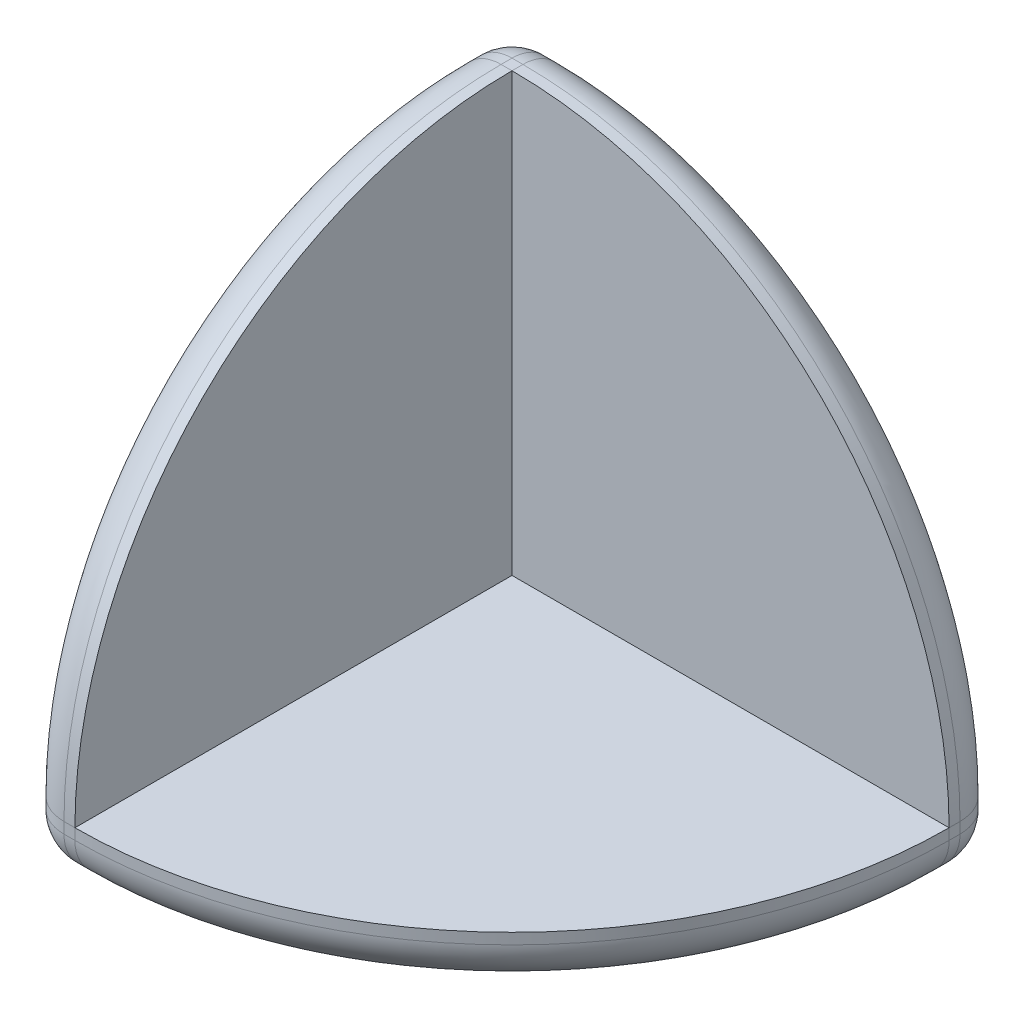
ISO-10303-21;
HEADER;
FILE_DESCRIPTION(('STEP AP214'),'2;1');
FILE_NAME('part.step','',(''),(''),'','','');
FILE_SCHEMA(('AUTOMOTIVE_DESIGN { 1 0 10303 214 1 1 1 1 }'));
ENDSEC;
DATA;
#1=APPLICATION_CONTEXT('core data for automotive mechanical design processes');
#2=APPLICATION_PROTOCOL_DEFINITION('international standard','automotive_design',2000,#1);
#3=PRODUCT_CONTEXT('',#1,'mechanical');
#4=PRODUCT('Part','Part','',(#3));
#5=PRODUCT_RELATED_PRODUCT_CATEGORY('part','',(#4));
#6=PRODUCT_DEFINITION_FORMATION('','',#4);
#7=PRODUCT_DEFINITION_CONTEXT('part definition',#1,'design');
#8=PRODUCT_DEFINITION('design','',#6,#7);
#9=PRODUCT_DEFINITION_SHAPE('','',#8);
#10=(LENGTH_UNIT() NAMED_UNIT(*) SI_UNIT(.MILLI.,.METRE.));
#11=(NAMED_UNIT(*) PLANE_ANGLE_UNIT() SI_UNIT($,.RADIAN.));
#12=(NAMED_UNIT(*) SI_UNIT($,.STERADIAN.) SOLID_ANGLE_UNIT());
#13=UNCERTAINTY_MEASURE_WITH_UNIT(LENGTH_MEASURE(1.E-05),#10,'distance_accuracy_value','');
#14=(GEOMETRIC_REPRESENTATION_CONTEXT(3) GLOBAL_UNCERTAINTY_ASSIGNED_CONTEXT((#13)) GLOBAL_UNIT_ASSIGNED_CONTEXT((#10,
#11,#12)) REPRESENTATION_CONTEXT('',''));
#15=CARTESIAN_POINT('',(0.,0.,0.));
#16=DIRECTION('',(0.,0.,1.));
#17=DIRECTION('',(1.,0.,0.));
#18=AXIS2_PLACEMENT_3D('',#15,#16,#17);
#19=CARTESIAN_POINT('',(0.,0.,3.175));
#20=DIRECTION('',(0.,0.,1.));
#21=DIRECTION('',(1.,0.,0.));
#22=AXIS2_PLACEMENT_3D('',#19,#20,#21);
#23=PLANE('',#22);
#24=DIRECTION('',(0.,1.,0.));
#25=VECTOR('',#24,1.);
#26=CARTESIAN_POINT('',(0.,0.,3.175));
#27=LINE('',#26,#25);
#28=CARTESIAN_POINT('',(0.,0.,3.175));
#29=VERTEX_POINT('',#28);
#30=CARTESIAN_POINT('',(0.,25.4,3.175));
#31=VERTEX_POINT('',#30);
#32=EDGE_CURVE('E151',#29,#31,#27,.T.);
#33=ORIENTED_EDGE('',*,*,#32,.F.);
#34=DIRECTION('',(1.,0.,0.));
#35=VECTOR('',#34,1.);
#36=CARTESIAN_POINT('',(0.,0.,3.175));
#37=LINE('',#36,#35);
#38=CARTESIAN_POINT('',(25.4,0.,3.175));
#39=VERTEX_POINT('',#38);
#40=EDGE_CURVE('E176',#29,#39,#37,.T.);
#41=ORIENTED_EDGE('',*,*,#40,.T.);
#42=CARTESIAN_POINT('',(0.,0.,3.175));
#43=DIRECTION('',(0.,0.,1.));
#44=DIRECTION('',(1.,0.,0.));
#45=AXIS2_PLACEMENT_3D('',#42,#43,#44);
#46=CIRCLE('',#45,25.4);
#47=EDGE_CURVE('E183',#39,#31,#46,.T.);
#48=ORIENTED_EDGE('',*,*,#47,.T.);
#49=EDGE_LOOP('',(#33,#41,#48));
#50=FACE_BOUND('',#49,.T.);
#51=ADVANCED_FACE('F37',(#50),#23,.T.);
#52=CARTESIAN_POINT('',(0.,0.,0.));
#53=DIRECTION('',(-1.,0.,0.));
#54=DIRECTION('',(0.,-1.,0.));
#55=AXIS2_PLACEMENT_3D('',#52,#53,#54);
#56=PLANE('',#55);
#57=DIRECTION('',(0.,0.,-1.));
#58=VECTOR('',#57,1.);
#59=CARTESIAN_POINT('',(0.,0.,28.575));
#60=LINE('',#59,#58);
#61=CARTESIAN_POINT('',(0.,0.,28.575));
#62=VERTEX_POINT('',#61);
#63=EDGE_CURVE('E161',#62,#29,#60,.T.);
#64=ORIENTED_EDGE('',*,*,#63,.T.);
#65=ORIENTED_EDGE('',*,*,#32,.T.);
#66=CARTESIAN_POINT('',(0.,0.,3.175));
#67=DIRECTION('',(-1.,0.,0.));
#68=DIRECTION('',(0.,-1.,0.));
#69=AXIS2_PLACEMENT_3D('',#66,#67,#68);
#70=CIRCLE('',#69,25.4);
#71=EDGE_CURVE('E144',#62,#31,#70,.T.);
#72=ORIENTED_EDGE('',*,*,#71,.F.);
#73=EDGE_LOOP('',(#64,#65,#72));
#74=FACE_BOUND('',#73,.T.);
#75=ADVANCED_FACE('F164',(#74),#56,.F.);
#76=CARTESIAN_POINT('',(25.4,0.,3.175));
#77=DIRECTION('',(-1.,0.,0.));
#78=DIRECTION('',(0.,0.,1.));
#79=AXIS2_PLACEMENT_3D('',#76,#77,#78);
#80=PLANE('',#79);
#81=DIRECTION('',(0.,1.,0.));
#82=VECTOR('',#81,1.);
#83=CARTESIAN_POINT('',(25.4,0.,3.175));
#84=LINE('',#83,#82);
#85=CARTESIAN_POINT('',(25.4,-0.635,3.175));
#86=VERTEX_POINT('',#85);
#87=EDGE_CURVE('E150',#86,#39,#84,.T.);
#88=ORIENTED_EDGE('',*,*,#87,.F.);
#89=DIRECTION('',(0.,0.,-1.));
#90=VECTOR('',#89,1.);
#91=CARTESIAN_POINT('',(25.4,-0.635,3.175));
#92=LINE('',#91,#90);
#93=CARTESIAN_POINT('',(25.4,-0.635,2.54));
#94=VERTEX_POINT('',#93);
#95=EDGE_CURVE('E217',#86,#94,#92,.T.);
#96=ORIENTED_EDGE('',*,*,#95,.T.);
#97=DIRECTION('',(0.,1.,0.));
#98=VECTOR('',#97,1.);
#99=CARTESIAN_POINT('',(25.4,0.,2.54));
#100=LINE('',#99,#98);
#101=CARTESIAN_POINT('',(25.4,0.,2.54));
#102=VERTEX_POINT('',#101);
#103=EDGE_CURVE('E215',#94,#102,#100,.T.);
#104=ORIENTED_EDGE('',*,*,#103,.T.);
#105=DIRECTION('',(0.,0.,-1.));
#106=VECTOR('',#105,1.);
#107=CARTESIAN_POINT('',(25.4,0.,3.175));
#108=LINE('',#107,#106);
#109=EDGE_CURVE('E191',#39,#102,#108,.T.);
#110=ORIENTED_EDGE('',*,*,#109,.F.);
#111=EDGE_LOOP('',(#88,#96,#104,#110));
#112=FACE_BOUND('',#111,.T.);
#113=ADVANCED_FACE('F302',(#112),#80,.F.);
#114=CARTESIAN_POINT('',(0.,0.,3.175));
#115=DIRECTION('',(0.,0.,-1.));
#116=DIRECTION('',(-1.,0.,0.));
#117=AXIS2_PLACEMENT_3D('',#114,#115,#116);
#118=CYLINDRICAL_SURFACE('',#117,25.4);
#119=ORIENTED_EDGE('',*,*,#109,.T.);
#120=CARTESIAN_POINT('',(0.,0.,2.54));
#121=DIRECTION('',(0.,0.,1.));
#122=DIRECTION('',(1.,0.,0.));
#123=AXIS2_PLACEMENT_3D('',#120,#121,#122);
#124=CIRCLE('',#123,25.4);
#125=CARTESIAN_POINT('',(0.,25.4,2.54));
#126=VERTEX_POINT('',#125);
#127=EDGE_CURVE('E11',#102,#126,#124,.T.);
#128=ORIENTED_EDGE('',*,*,#127,.T.);
#129=DIRECTION('',(0.,0.,-1.));
#130=VECTOR('',#129,1.);
#131=CARTESIAN_POINT('',(0.,25.4,3.175));
#132=LINE('',#131,#130);
#133=EDGE_CURVE('E188',#31,#126,#132,.T.);
#134=ORIENTED_EDGE('',*,*,#133,.F.);
#135=ORIENTED_EDGE('',*,*,#47,.F.);
#136=EDGE_LOOP('',(#119,#128,#134,#135));
#137=FACE_BOUND('',#136,.T.);
#138=ADVANCED_FACE('F300',(#137),#118,.T.);
#139=CARTESIAN_POINT('',(0.,25.4,3.175));
#140=DIRECTION('',(0.,-1.,0.));
#141=DIRECTION('',(0.,0.,-1.));
#142=AXIS2_PLACEMENT_3D('',#139,#140,#141);
#143=PLANE('',#142);
#144=DIRECTION('',(-1.,0.,0.));
#145=VECTOR('',#144,1.);
#146=CARTESIAN_POINT('',(0.,25.4,2.54));
#147=LINE('',#146,#145);
#148=CARTESIAN_POINT('',(-0.634999999999999,25.4,2.54));
#149=VERTEX_POINT('',#148);
#150=EDGE_CURVE('E211',#126,#149,#147,.T.);
#151=ORIENTED_EDGE('',*,*,#150,.T.);
#152=DIRECTION('',(0.,0.,-1.));
#153=VECTOR('',#152,1.);
#154=CARTESIAN_POINT('',(-0.634999999999999,25.4,3.175));
#155=LINE('',#154,#153);
#156=CARTESIAN_POINT('',(-0.635,25.4,3.175));
#157=VERTEX_POINT('',#156);
#158=EDGE_CURVE('E213',#149,#157,#155,.F.);
#159=ORIENTED_EDGE('',*,*,#158,.T.);
#160=DIRECTION('',(-1.,0.,0.));
#161=VECTOR('',#160,1.);
#162=CARTESIAN_POINT('',(0.,25.4,3.175));
#163=LINE('',#162,#161);
#164=EDGE_CURVE('E186',#31,#157,#163,.T.);
#165=ORIENTED_EDGE('',*,*,#164,.F.);
#166=ORIENTED_EDGE('',*,*,#133,.T.);
#167=EDGE_LOOP('',(#151,#159,#165,#166));
#168=FACE_BOUND('',#167,.T.);
#169=ADVANCED_FACE('F311',(#168),#143,.F.);
#170=CARTESIAN_POINT('',(-3.175,0.,3.175));
#171=DIRECTION('',(1.,0.,0.));
#172=DIRECTION('',(0.,1.,0.));
#173=AXIS2_PLACEMENT_3D('',#170,#171,#172);
#174=PLANE('',#173);
#175=DIRECTION('',(0.,0.,-1.));
#176=VECTOR('',#175,1.);
#177=CARTESIAN_POINT('',(-3.175,22.86,3.175));
#178=LINE('',#177,#176);
#179=CARTESIAN_POINT('',(-3.175,22.86,3.175));
#180=VERTEX_POINT('',#179);
#181=CARTESIAN_POINT('',(-3.175,22.86,2.54));
#182=VERTEX_POINT('',#181);
#183=EDGE_CURVE('E202',#180,#182,#178,.T.);
#184=ORIENTED_EDGE('',*,*,#183,.T.);
#185=DIRECTION('',(0.,-1.,0.));
#186=VECTOR('',#185,1.);
#187=CARTESIAN_POINT('',(-3.175,0.,2.54));
#188=LINE('',#187,#186);
#189=CARTESIAN_POINT('',(-3.175,-0.635,2.54));
#190=VERTEX_POINT('',#189);
#191=EDGE_CURVE('E209',#182,#190,#188,.T.);
#192=ORIENTED_EDGE('',*,*,#191,.T.);
#193=DIRECTION('',(0.,0.,-1.));
#194=VECTOR('',#193,1.);
#195=CARTESIAN_POINT('',(-3.175,-0.635,3.175));
#196=LINE('',#195,#194);
#197=CARTESIAN_POINT('',(-3.175,-0.635,26.035));
#198=VERTEX_POINT('',#197);
#199=EDGE_CURVE('E207',#190,#198,#196,.F.);
#200=ORIENTED_EDGE('',*,*,#199,.T.);
#201=DIRECTION('',(0.,-1.,0.));
#202=VECTOR('',#201,1.);
#203=CARTESIAN_POINT('',(-3.175,0.,26.035));
#204=LINE('',#203,#202);
#205=CARTESIAN_POINT('',(-3.175,0.,26.035));
#206=VERTEX_POINT('',#205);
#207=EDGE_CURVE('E204',#198,#206,#204,.F.);
#208=ORIENTED_EDGE('',*,*,#207,.T.);
#209=CARTESIAN_POINT('',(-3.175,0.,3.175));
#210=DIRECTION('',(1.,0.,0.));
#211=DIRECTION('',(0.,1.,0.));
#212=AXIS2_PLACEMENT_3D('',#209,#210,#211);
#213=CIRCLE('',#212,22.86);
#214=EDGE_CURVE('E200',#206,#180,#213,.F.);
#215=ORIENTED_EDGE('',*,*,#214,.T.);
#216=EDGE_LOOP('',(#184,#192,#200,#208,#215));
#217=FACE_BOUND('',#216,.T.);
#218=ADVANCED_FACE('F369',(#217),#174,.F.);
#219=CARTESIAN_POINT('',(0.,-3.175,3.175));
#220=DIRECTION('',(0.,1.,0.));
#221=DIRECTION('',(0.,0.,1.));
#222=AXIS2_PLACEMENT_3D('',#219,#220,#221);
#223=PLANE('',#222);
#224=DIRECTION('',(0.,0.,-1.));
#225=VECTOR('',#224,1.);
#226=CARTESIAN_POINT('',(-0.634999999999997,-3.175,3.175));
#227=LINE('',#226,#225);
#228=CARTESIAN_POINT('',(-0.634999999999997,-3.175,26.035));
#229=VERTEX_POINT('',#228);
#230=CARTESIAN_POINT('',(-0.634999999999997,-3.175,2.54));
#231=VERTEX_POINT('',#230);
#232=EDGE_CURVE('E226',#229,#231,#227,.T.);
#233=ORIENTED_EDGE('',*,*,#232,.T.);
#234=DIRECTION('',(1.,0.,0.));
#235=VECTOR('',#234,1.);
#236=CARTESIAN_POINT('',(0.,-3.175,2.54));
#237=LINE('',#236,#235);
#238=CARTESIAN_POINT('',(22.86,-3.175,2.54));
#239=VERTEX_POINT('',#238);
#240=EDGE_CURVE('E228',#231,#239,#237,.T.);
#241=ORIENTED_EDGE('',*,*,#240,.T.);
#242=DIRECTION('',(0.,0.,-1.));
#243=VECTOR('',#242,1.);
#244=CARTESIAN_POINT('',(22.86,-3.175,3.175));
#245=LINE('',#244,#243);
#246=CARTESIAN_POINT('',(22.86,-3.175,3.175));
#247=VERTEX_POINT('',#246);
#248=EDGE_CURVE('E223',#239,#247,#245,.F.);
#249=ORIENTED_EDGE('',*,*,#248,.T.);
#250=CARTESIAN_POINT('',(0.,-3.175,3.175));
#251=DIRECTION('',(0.,1.,0.));
#252=DIRECTION('',(0.,0.,1.));
#253=AXIS2_PLACEMENT_3D('',#250,#251,#252);
#254=CIRCLE('',#253,22.86);
#255=CARTESIAN_POINT('',(0.,-3.175,26.035));
#256=VERTEX_POINT('',#255);
#257=EDGE_CURVE('E219',#247,#256,#254,.F.);
#258=ORIENTED_EDGE('',*,*,#257,.T.);
#259=DIRECTION('',(-1.,0.,0.));
#260=VECTOR('',#259,1.);
#261=CARTESIAN_POINT('',(0.,-3.175,26.035));
#262=LINE('',#261,#260);
#263=EDGE_CURVE('E221',#256,#229,#262,.T.);
#264=ORIENTED_EDGE('',*,*,#263,.T.);
#265=EDGE_LOOP('',(#233,#241,#249,#258,#264));
#266=FACE_BOUND('',#265,.T.);
#267=ADVANCED_FACE('F341',(#266),#223,.F.);
#268=CARTESIAN_POINT('',(0.,0.,0.));
#269=DIRECTION('',(0.,0.,1.));
#270=DIRECTION('',(1.,0.,0.));
#271=AXIS2_PLACEMENT_3D('',#268,#269,#270);
#272=PLANE('',#271);
#273=DIRECTION('',(0.,1.,0.));
#274=VECTOR('',#273,1.);
#275=CARTESIAN_POINT('',(22.86,0.,0.));
#276=LINE('',#275,#274);
#277=CARTESIAN_POINT('',(22.86,0.,0.));
#278=VERTEX_POINT('',#277);
#279=CARTESIAN_POINT('',(22.86,-0.635,0.));
#280=VERTEX_POINT('',#279);
#281=EDGE_CURVE('E234',#278,#280,#276,.F.);
#282=ORIENTED_EDGE('',*,*,#281,.T.);
#283=DIRECTION('',(1.,0.,0.));
#284=VECTOR('',#283,1.);
#285=CARTESIAN_POINT('',(0.,-0.635,0.));
#286=LINE('',#285,#284);
#287=CARTESIAN_POINT('',(-0.634999999999997,-0.635,0.));
#288=VERTEX_POINT('',#287);
#289=EDGE_CURVE('E54',#280,#288,#286,.F.);
#290=ORIENTED_EDGE('',*,*,#289,.T.);
#291=DIRECTION('',(0.,-1.,0.));
#292=VECTOR('',#291,1.);
#293=CARTESIAN_POINT('',(-0.634999999999997,0.,0.));
#294=LINE('',#293,#292);
#295=CARTESIAN_POINT('',(-0.634999999999999,22.86,0.));
#296=VERTEX_POINT('',#295);
#297=EDGE_CURVE('E236',#288,#296,#294,.F.);
#298=ORIENTED_EDGE('',*,*,#297,.T.);
#299=DIRECTION('',(-1.,0.,0.));
#300=VECTOR('',#299,1.);
#301=CARTESIAN_POINT('',(0.,22.86,0.));
#302=LINE('',#301,#300);
#303=CARTESIAN_POINT('',(0.,22.86,0.));
#304=VERTEX_POINT('',#303);
#305=EDGE_CURVE('E232',#296,#304,#302,.F.);
#306=ORIENTED_EDGE('',*,*,#305,.T.);
#307=CARTESIAN_POINT('',(0.,0.,0.));
#308=DIRECTION('',(0.,0.,1.));
#309=DIRECTION('',(1.,0.,0.));
#310=AXIS2_PLACEMENT_3D('',#307,#308,#309);
#311=CIRCLE('',#310,22.86);
#312=EDGE_CURVE('E230',#304,#278,#311,.F.);
#313=ORIENTED_EDGE('',*,*,#312,.T.);
#314=EDGE_LOOP('',(#282,#290,#298,#306,#313));
#315=FACE_BOUND('',#314,.T.);
#316=ADVANCED_FACE('F364',(#315),#272,.F.);
#317=CARTESIAN_POINT('',(0.,0.,3.175));
#318=DIRECTION('',(-1.,0.,0.));
#319=DIRECTION('',(0.,-1.,0.));
#320=AXIS2_PLACEMENT_3D('',#317,#318,#319);
#321=CYLINDRICAL_SURFACE('',#320,25.4);
#322=ORIENTED_EDGE('',*,*,#164,.T.);
#323=CARTESIAN_POINT('',(-0.634999999999997,0.,3.175));
#324=DIRECTION('',(1.,0.,0.));
#325=DIRECTION('',(0.,1.,0.));
#326=AXIS2_PLACEMENT_3D('',#323,#324,#325);
#327=CIRCLE('',#326,25.4);
#328=CARTESIAN_POINT('',(-0.634999999999997,0.,28.575));
#329=VERTEX_POINT('',#328);
#330=EDGE_CURVE('E146',#157,#329,#327,.T.);
#331=ORIENTED_EDGE('',*,*,#330,.T.);
#332=DIRECTION('',(-1.,0.,0.));
#333=VECTOR('',#332,1.);
#334=CARTESIAN_POINT('',(0.,0.,28.575));
#335=LINE('',#334,#333);
#336=EDGE_CURVE('E139',#62,#329,#335,.T.);
#337=ORIENTED_EDGE('',*,*,#336,.F.);
#338=ORIENTED_EDGE('',*,*,#71,.T.);
#339=EDGE_LOOP('',(#322,#331,#337,#338));
#340=FACE_BOUND('',#339,.T.);
#341=ADVANCED_FACE('F142',(#340),#321,.T.);
#342=CARTESIAN_POINT('',(0.,0.,28.575));
#343=DIRECTION('',(0.,0.,-1.));
#344=DIRECTION('',(-1.,0.,0.));
#345=AXIS2_PLACEMENT_3D('',#342,#343,#344);
#346=PLANE('',#345);
#347=ORIENTED_EDGE('',*,*,#336,.T.);
#348=DIRECTION('',(0.,-1.,0.));
#349=VECTOR('',#348,1.);
#350=CARTESIAN_POINT('',(-0.634999999999997,0.,28.575));
#351=LINE('',#350,#349);
#352=CARTESIAN_POINT('',(-0.634999999999997,-0.635,28.575));
#353=VERTEX_POINT('',#352);
#354=EDGE_CURVE('E198',#329,#353,#351,.T.);
#355=ORIENTED_EDGE('',*,*,#354,.T.);
#356=DIRECTION('',(-1.,0.,0.));
#357=VECTOR('',#356,1.);
#358=CARTESIAN_POINT('',(0.,-0.635,28.575));
#359=LINE('',#358,#357);
#360=CARTESIAN_POINT('',(0.,-0.635,28.575));
#361=VERTEX_POINT('',#360);
#362=EDGE_CURVE('E157',#353,#361,#359,.F.);
#363=ORIENTED_EDGE('',*,*,#362,.T.);
#364=DIRECTION('',(0.,-1.,0.));
#365=VECTOR('',#364,1.);
#366=CARTESIAN_POINT('',(0.,0.,28.575));
#367=LINE('',#366,#365);
#368=EDGE_CURVE('E154',#62,#361,#367,.T.);
#369=ORIENTED_EDGE('',*,*,#368,.F.);
#370=EDGE_LOOP('',(#347,#355,#363,#369));
#371=FACE_BOUND('',#370,.T.);
#372=ADVANCED_FACE('F155',(#371),#346,.F.);
#373=CARTESIAN_POINT('',(0.,0.,3.175));
#374=DIRECTION('',(0.,-1.,0.));
#375=DIRECTION('',(0.,0.,-1.));
#376=AXIS2_PLACEMENT_3D('',#373,#374,#375);
#377=CYLINDRICAL_SURFACE('',#376,25.4);
#378=ORIENTED_EDGE('',*,*,#368,.T.);
#379=CARTESIAN_POINT('',(0.,-0.635,3.175));
#380=DIRECTION('',(0.,1.,0.));
#381=DIRECTION('',(0.,0.,1.));
#382=AXIS2_PLACEMENT_3D('',#379,#380,#381);
#383=CIRCLE('',#382,25.4);
#384=EDGE_CURVE('E46',#361,#86,#383,.T.);
#385=ORIENTED_EDGE('',*,*,#384,.T.);
#386=ORIENTED_EDGE('',*,*,#87,.T.);
#387=CARTESIAN_POINT('',(0.,0.,3.175));
#388=DIRECTION('',(0.,-1.,0.));
#389=DIRECTION('',(0.,0.,-1.));
#390=AXIS2_PLACEMENT_3D('',#387,#388,#389);
#391=CIRCLE('',#390,25.4);
#392=EDGE_CURVE('E170',#39,#62,#391,.T.);
#393=ORIENTED_EDGE('',*,*,#392,.T.);
#394=EDGE_LOOP('',(#378,#385,#386,#393));
#395=FACE_BOUND('',#394,.T.);
#396=ADVANCED_FACE('F171',(#395),#377,.T.);
#397=CARTESIAN_POINT('',(0.,0.,3.175));
#398=DIRECTION('',(0.,-1.,0.));
#399=DIRECTION('',(0.,0.,-1.));
#400=AXIS2_PLACEMENT_3D('',#397,#398,#399);
#401=PLANE('',#400);
#402=ORIENTED_EDGE('',*,*,#40,.F.);
#403=ORIENTED_EDGE('',*,*,#63,.F.);
#404=ORIENTED_EDGE('',*,*,#392,.F.);
#405=EDGE_LOOP('',(#402,#403,#404));
#406=FACE_BOUND('',#405,.T.);
#407=ADVANCED_FACE('F178',(#406),#401,.F.);
#408=CARTESIAN_POINT('',(22.86,0.,2.54));
#409=DIRECTION('',(0.,1.,0.));
#410=DIRECTION('',(0.,0.,1.));
#411=AXIS2_PLACEMENT_3D('',#408,#409,#410);
#412=CYLINDRICAL_SURFACE('',#411,2.54);
#413=CARTESIAN_POINT('',(22.86,-0.635,2.54));
#414=DIRECTION('',(0.,-1.,0.));
#415=DIRECTION('',(0.,0.,-1.));
#416=AXIS2_PLACEMENT_3D('',#413,#414,#415);
#417=CIRCLE('',#416,2.54);
#418=EDGE_CURVE('E285',#280,#94,#417,.T.);
#419=ORIENTED_EDGE('',*,*,#418,.F.);
#420=ORIENTED_EDGE('',*,*,#281,.F.);
#421=CARTESIAN_POINT('',(22.86,0.,2.54));
#422=DIRECTION('',(0.,1.,0.));
#423=DIRECTION('',(0.,0.,1.));
#424=AXIS2_PLACEMENT_3D('',#421,#422,#423);
#425=CIRCLE('',#424,2.54);
#426=EDGE_CURVE('E41',#102,#278,#425,.T.);
#427=ORIENTED_EDGE('',*,*,#426,.F.);
#428=ORIENTED_EDGE('',*,*,#103,.F.);
#429=EDGE_LOOP('',(#419,#420,#427,#428));
#430=FACE_BOUND('',#429,.T.);
#431=ADVANCED_FACE('F39',(#430),#412,.T.);
#432=CARTESIAN_POINT('',(0.,0.,2.54));
#433=DIRECTION('',(0.,0.,1.));
#434=DIRECTION('',(1.,0.,0.));
#435=AXIS2_PLACEMENT_3D('',#432,#433,#434);
#436=TOROIDAL_SURFACE('',#435,22.86,2.54);
#437=ORIENTED_EDGE('',*,*,#426,.T.);
#438=ORIENTED_EDGE('',*,*,#312,.F.);
#439=CARTESIAN_POINT('',(0.,22.86,2.54));
#440=DIRECTION('',(-1.,0.,0.));
#441=DIRECTION('',(0.,0.,1.));
#442=AXIS2_PLACEMENT_3D('',#439,#440,#441);
#443=CIRCLE('',#442,2.54);
#444=EDGE_CURVE('E283',#126,#304,#443,.T.);
#445=ORIENTED_EDGE('',*,*,#444,.F.);
#446=ORIENTED_EDGE('',*,*,#127,.F.);
#447=EDGE_LOOP('',(#437,#438,#445,#446));
#448=FACE_BOUND('',#447,.T.);
#449=ADVANCED_FACE('F308',(#448),#436,.T.);
#450=CARTESIAN_POINT('',(22.86,-0.635,2.54));
#451=DIRECTION('',(0.,0.,1.));
#452=DIRECTION('',(1.,0.,0.));
#453=AXIS2_PLACEMENT_3D('',#450,#451,#452);
#454=SPHERICAL_SURFACE('',#453,2.54);
#455=CARTESIAN_POINT('',(22.86,-0.635,2.54));
#456=DIRECTION('',(1.,0.,0.));
#457=DIRECTION('',(0.,0.,-1.));
#458=AXIS2_PLACEMENT_3D('',#455,#456,#457);
#459=CIRCLE('',#458,2.54);
#460=EDGE_CURVE('E278',#280,#239,#459,.F.);
#461=ORIENTED_EDGE('',*,*,#460,.F.);
#462=ORIENTED_EDGE('',*,*,#418,.T.);
#463=CARTESIAN_POINT('',(22.86,-0.635,2.54));
#464=DIRECTION('',(0.,0.,-1.));
#465=DIRECTION('',(-1.,0.,0.));
#466=AXIS2_PLACEMENT_3D('',#463,#464,#465);
#467=CIRCLE('',#466,2.54);
#468=EDGE_CURVE('E280',#239,#94,#467,.F.);
#469=ORIENTED_EDGE('',*,*,#468,.F.);
#470=EDGE_LOOP('',(#461,#462,#469));
#471=FACE_BOUND('',#470,.T.);
#472=ADVANCED_FACE('F345',(#471),#454,.T.);
#473=CARTESIAN_POINT('',(0.,22.86,2.54));
#474=DIRECTION('',(-1.,0.,0.));
#475=DIRECTION('',(0.,0.,1.));
#476=AXIS2_PLACEMENT_3D('',#473,#474,#475);
#477=CYLINDRICAL_SURFACE('',#476,2.54);
#478=ORIENTED_EDGE('',*,*,#444,.T.);
#479=ORIENTED_EDGE('',*,*,#305,.F.);
#480=CARTESIAN_POINT('',(-0.634999999999999,22.86,2.54));
#481=DIRECTION('',(-1.,0.,0.));
#482=DIRECTION('',(0.,0.,1.));
#483=AXIS2_PLACEMENT_3D('',#480,#481,#482);
#484=CIRCLE('',#483,2.54);
#485=EDGE_CURVE('E272',#149,#296,#484,.T.);
#486=ORIENTED_EDGE('',*,*,#485,.F.);
#487=ORIENTED_EDGE('',*,*,#150,.F.);
#488=EDGE_LOOP('',(#478,#479,#486,#487));
#489=FACE_BOUND('',#488,.T.);
#490=ADVANCED_FACE('F347',(#489),#477,.T.);
#491=CARTESIAN_POINT('',(22.86,-0.635,3.175));
#492=DIRECTION('',(0.,0.,-1.));
#493=DIRECTION('',(-1.,0.,0.));
#494=AXIS2_PLACEMENT_3D('',#491,#492,#493);
#495=CYLINDRICAL_SURFACE('',#494,2.54);
#496=ORIENTED_EDGE('',*,*,#468,.T.);
#497=ORIENTED_EDGE('',*,*,#95,.F.);
#498=CARTESIAN_POINT('',(22.86,-0.635,3.175));
#499=DIRECTION('',(0.,0.,1.));
#500=DIRECTION('',(1.,0.,0.));
#501=AXIS2_PLACEMENT_3D('',#498,#499,#500);
#502=CIRCLE('',#501,2.54);
#503=EDGE_CURVE('E269',#247,#86,#502,.T.);
#504=ORIENTED_EDGE('',*,*,#503,.F.);
#505=ORIENTED_EDGE('',*,*,#248,.F.);
#506=EDGE_LOOP('',(#496,#497,#504,#505));
#507=FACE_BOUND('',#506,.T.);
#508=ADVANCED_FACE('F339',(#507),#495,.T.);
#509=CARTESIAN_POINT('',(0.,-0.635,2.54));
#510=DIRECTION('',(1.,0.,0.));
#511=DIRECTION('',(0.,0.,-1.));
#512=AXIS2_PLACEMENT_3D('',#509,#510,#511);
#513=CYLINDRICAL_SURFACE('',#512,2.54);
#514=ORIENTED_EDGE('',*,*,#460,.T.);
#515=ORIENTED_EDGE('',*,*,#240,.F.);
#516=CARTESIAN_POINT('',(-0.634999999999997,-0.635,2.54));
#517=DIRECTION('',(-1.,0.,0.));
#518=DIRECTION('',(0.,0.,1.));
#519=AXIS2_PLACEMENT_3D('',#516,#517,#518);
#520=CIRCLE('',#519,2.54);
#521=EDGE_CURVE('E266',#288,#231,#520,.T.);
#522=ORIENTED_EDGE('',*,*,#521,.F.);
#523=ORIENTED_EDGE('',*,*,#289,.F.);
#524=EDGE_LOOP('',(#514,#515,#522,#523));
#525=FACE_BOUND('',#524,.T.);
#526=ADVANCED_FACE('F344',(#525),#513,.T.);
#527=CARTESIAN_POINT('',(-0.634999999999997,0.,2.54));
#528=DIRECTION('',(0.,-1.,0.));
#529=DIRECTION('',(1.,0.,0.));
#530=AXIS2_PLACEMENT_3D('',#527,#528,#529);
#531=CYLINDRICAL_SURFACE('',#530,2.54);
#532=CARTESIAN_POINT('',(-0.634999999999999,22.86,2.54));
#533=DIRECTION('',(0.,1.,0.));
#534=DIRECTION('',(0.,0.,1.));
#535=AXIS2_PLACEMENT_3D('',#532,#533,#534);
#536=CIRCLE('',#535,2.54);
#537=EDGE_CURVE('E275',#296,#182,#536,.T.);
#538=ORIENTED_EDGE('',*,*,#537,.F.);
#539=ORIENTED_EDGE('',*,*,#297,.F.);
#540=CARTESIAN_POINT('',(-0.634999999999997,-0.635,2.54));
#541=DIRECTION('',(0.,-1.,0.));
#542=DIRECTION('',(1.,0.,0.));
#543=AXIS2_PLACEMENT_3D('',#540,#541,#542);
#544=CIRCLE('',#543,2.54);
#545=EDGE_CURVE('E263',#190,#288,#544,.T.);
#546=ORIENTED_EDGE('',*,*,#545,.F.);
#547=ORIENTED_EDGE('',*,*,#191,.F.);
#548=EDGE_LOOP('',(#538,#539,#546,#547));
#549=FACE_BOUND('',#548,.T.);
#550=ADVANCED_FACE('F402',(#549),#531,.T.);
#551=CARTESIAN_POINT('',(-0.634999999999999,22.86,2.54));
#552=DIRECTION('',(0.,0.,1.));
#553=DIRECTION('',(1.,0.,0.));
#554=AXIS2_PLACEMENT_3D('',#551,#552,#553);
#555=SPHERICAL_SURFACE('',#554,2.54);
#556=ORIENTED_EDGE('',*,*,#485,.T.);
#557=ORIENTED_EDGE('',*,*,#537,.T.);
#558=CARTESIAN_POINT('',(-0.634999999999999,22.86,2.54));
#559=DIRECTION('',(0.,0.,-1.));
#560=DIRECTION('',(-1.,0.,0.));
#561=AXIS2_PLACEMENT_3D('',#558,#559,#560);
#562=CIRCLE('',#561,2.54);
#563=EDGE_CURVE('E260',#149,#182,#562,.F.);
#564=ORIENTED_EDGE('',*,*,#563,.F.);
#565=EDGE_LOOP('',(#556,#557,#564));
#566=FACE_BOUND('',#565,.T.);
#567=ADVANCED_FACE('F399',(#566),#555,.T.);
#568=CARTESIAN_POINT('',(0.,-0.635,3.175));
#569=DIRECTION('',(0.,1.,0.));
#570=DIRECTION('',(0.,0.,1.));
#571=AXIS2_PLACEMENT_3D('',#568,#569,#570);
#572=TOROIDAL_SURFACE('',#571,22.86,2.54);
#573=ORIENTED_EDGE('',*,*,#503,.T.);
#574=ORIENTED_EDGE('',*,*,#384,.F.);
#575=CARTESIAN_POINT('',(0.,-0.635,26.035));
#576=DIRECTION('',(-1.,0.,0.));
#577=DIRECTION('',(0.,0.,1.));
#578=AXIS2_PLACEMENT_3D('',#575,#576,#577);
#579=CIRCLE('',#578,2.54);
#580=EDGE_CURVE('E257',#256,#361,#579,.T.);
#581=ORIENTED_EDGE('',*,*,#580,.F.);
#582=ORIENTED_EDGE('',*,*,#257,.F.);
#583=EDGE_LOOP('',(#573,#574,#581,#582));
#584=FACE_BOUND('',#583,.T.);
#585=ADVANCED_FACE('F335',(#584),#572,.T.);
#586=CARTESIAN_POINT('',(-0.634999999999997,-0.635,2.54));
#587=DIRECTION('',(0.,0.,1.));
#588=DIRECTION('',(1.,0.,0.));
#589=AXIS2_PLACEMENT_3D('',#586,#587,#588);
#590=SPHERICAL_SURFACE('',#589,2.54);
#591=ORIENTED_EDGE('',*,*,#545,.T.);
#592=ORIENTED_EDGE('',*,*,#521,.T.);
#593=CARTESIAN_POINT('',(-0.634999999999997,-0.635,2.54));
#594=DIRECTION('',(0.,0.,-1.));
#595=DIRECTION('',(-1.,0.,0.));
#596=AXIS2_PLACEMENT_3D('',#593,#594,#595);
#597=CIRCLE('',#596,2.54);
#598=EDGE_CURVE('E254',#190,#231,#597,.F.);
#599=ORIENTED_EDGE('',*,*,#598,.F.);
#600=EDGE_LOOP('',(#591,#592,#599));
#601=FACE_BOUND('',#600,.T.);
#602=ADVANCED_FACE('F393',(#601),#590,.T.);
#603=CARTESIAN_POINT('',(-0.634999999999999,22.86,3.175));
#604=DIRECTION('',(0.,0.,-1.));
#605=DIRECTION('',(-1.,0.,0.));
#606=AXIS2_PLACEMENT_3D('',#603,#604,#605);
#607=CYLINDRICAL_SURFACE('',#606,2.54);
#608=ORIENTED_EDGE('',*,*,#563,.T.);
#609=ORIENTED_EDGE('',*,*,#183,.F.);
#610=CARTESIAN_POINT('',(-0.634999999999999,22.86,3.175));
#611=DIRECTION('',(0.,0.,1.));
#612=DIRECTION('',(1.,0.,0.));
#613=AXIS2_PLACEMENT_3D('',#610,#611,#612);
#614=CIRCLE('',#613,2.54);
#615=EDGE_CURVE('E251',#157,#180,#614,.T.);
#616=ORIENTED_EDGE('',*,*,#615,.F.);
#617=ORIENTED_EDGE('',*,*,#158,.F.);
#618=EDGE_LOOP('',(#608,#609,#616,#617));
#619=FACE_BOUND('',#618,.T.);
#620=ADVANCED_FACE('F317',(#619),#607,.T.);
#621=CARTESIAN_POINT('',(0.,-0.635,26.035));
#622=DIRECTION('',(-1.,0.,0.));
#623=DIRECTION('',(0.,0.,1.));
#624=AXIS2_PLACEMENT_3D('',#621,#622,#623);
#625=CYLINDRICAL_SURFACE('',#624,2.54);
#626=ORIENTED_EDGE('',*,*,#580,.T.);
#627=ORIENTED_EDGE('',*,*,#362,.F.);
#628=CARTESIAN_POINT('',(-0.634999999999997,-0.635,26.035));
#629=DIRECTION('',(-1.,0.,0.));
#630=DIRECTION('',(0.,0.,1.));
#631=AXIS2_PLACEMENT_3D('',#628,#629,#630);
#632=CIRCLE('',#631,2.54);
#633=EDGE_CURVE('E248',#229,#353,#632,.T.);
#634=ORIENTED_EDGE('',*,*,#633,.F.);
#635=ORIENTED_EDGE('',*,*,#263,.F.);
#636=EDGE_LOOP('',(#626,#627,#634,#635));
#637=FACE_BOUND('',#636,.T.);
#638=ADVANCED_FACE('F332',(#637),#625,.T.);
#639=CARTESIAN_POINT('',(-0.634999999999997,-0.635,3.175));
#640=DIRECTION('',(0.,0.,-1.));
#641=DIRECTION('',(-1.,0.,0.));
#642=AXIS2_PLACEMENT_3D('',#639,#640,#641);
#643=CYLINDRICAL_SURFACE('',#642,2.54);
#644=ORIENTED_EDGE('',*,*,#598,.T.);
#645=ORIENTED_EDGE('',*,*,#232,.F.);
#646=CARTESIAN_POINT('',(-0.634999999999997,-0.635,26.035));
#647=DIRECTION('',(0.,0.,1.));
#648=DIRECTION('',(1.,0.,0.));
#649=AXIS2_PLACEMENT_3D('',#646,#647,#648);
#650=CIRCLE('',#649,2.54);
#651=EDGE_CURVE('E245',#198,#229,#650,.T.);
#652=ORIENTED_EDGE('',*,*,#651,.F.);
#653=ORIENTED_EDGE('',*,*,#199,.F.);
#654=EDGE_LOOP('',(#644,#645,#652,#653));
#655=FACE_BOUND('',#654,.T.);
#656=ADVANCED_FACE('F385',(#655),#643,.T.);
#657=CARTESIAN_POINT('',(-0.634999999999997,0.,3.175));
#658=DIRECTION('',(1.,0.,0.));
#659=DIRECTION('',(0.,1.,0.));
#660=AXIS2_PLACEMENT_3D('',#657,#658,#659);
#661=TOROIDAL_SURFACE('',#660,22.86,2.54);
#662=ORIENTED_EDGE('',*,*,#615,.T.);
#663=ORIENTED_EDGE('',*,*,#214,.F.);
#664=CARTESIAN_POINT('',(-0.634999999999997,0.,26.035));
#665=DIRECTION('',(0.,-1.,0.));
#666=DIRECTION('',(1.,0.,0.));
#667=AXIS2_PLACEMENT_3D('',#664,#665,#666);
#668=CIRCLE('',#667,2.54);
#669=EDGE_CURVE('E243',#329,#206,#668,.T.);
#670=ORIENTED_EDGE('',*,*,#669,.F.);
#671=ORIENTED_EDGE('',*,*,#330,.F.);
#672=EDGE_LOOP('',(#662,#663,#670,#671));
#673=FACE_BOUND('',#672,.T.);
#674=ADVANCED_FACE('F320',(#673),#661,.T.);
#675=CARTESIAN_POINT('',(-0.634999999999997,-0.635,26.035));
#676=DIRECTION('',(0.,0.,1.));
#677=DIRECTION('',(1.,0.,0.));
#678=AXIS2_PLACEMENT_3D('',#675,#676,#677);
#679=SPHERICAL_SURFACE('',#678,2.54);
#680=ORIENTED_EDGE('',*,*,#651,.T.);
#681=ORIENTED_EDGE('',*,*,#633,.T.);
#682=CARTESIAN_POINT('',(-0.634999999999997,-0.635,26.035));
#683=DIRECTION('',(0.,-1.,0.));
#684=DIRECTION('',(1.,0.,0.));
#685=AXIS2_PLACEMENT_3D('',#682,#683,#684);
#686=CIRCLE('',#685,2.54);
#687=EDGE_CURVE('E241',#198,#353,#686,.F.);
#688=ORIENTED_EDGE('',*,*,#687,.F.);
#689=EDGE_LOOP('',(#680,#681,#688));
#690=FACE_BOUND('',#689,.T.);
#691=ADVANCED_FACE('F328',(#690),#679,.T.);
#692=CARTESIAN_POINT('',(-0.634999999999997,0.,26.035));
#693=DIRECTION('',(0.,-1.,0.));
#694=DIRECTION('',(1.,0.,0.));
#695=AXIS2_PLACEMENT_3D('',#692,#693,#694);
#696=CYLINDRICAL_SURFACE('',#695,2.54);
#697=ORIENTED_EDGE('',*,*,#669,.T.);
#698=ORIENTED_EDGE('',*,*,#207,.F.);
#699=ORIENTED_EDGE('',*,*,#687,.T.);
#700=ORIENTED_EDGE('',*,*,#354,.F.);
#701=EDGE_LOOP('',(#697,#698,#699,#700));
#702=FACE_BOUND('',#701,.T.);
#703=ADVANCED_FACE('F324',(#702),#696,.T.);
#704=CLOSED_SHELL('',(#51,#75,#113,#138,#169,#218,#267,#316,#341,#372,#396,#407,#431,#449,#472,
#490,#508,#526,#550,#567,#585,#602,#620,#638,#656,#674,#691,#703));
#705=MANIFOLD_SOLID_BREP('B2',#704);
#706=ADVANCED_BREP_SHAPE_REPRESENTATION('',(#18,#705),#14);
#707=SHAPE_DEFINITION_REPRESENTATION(#9,#706);
ENDSEC;
END-ISO-10303-21;
